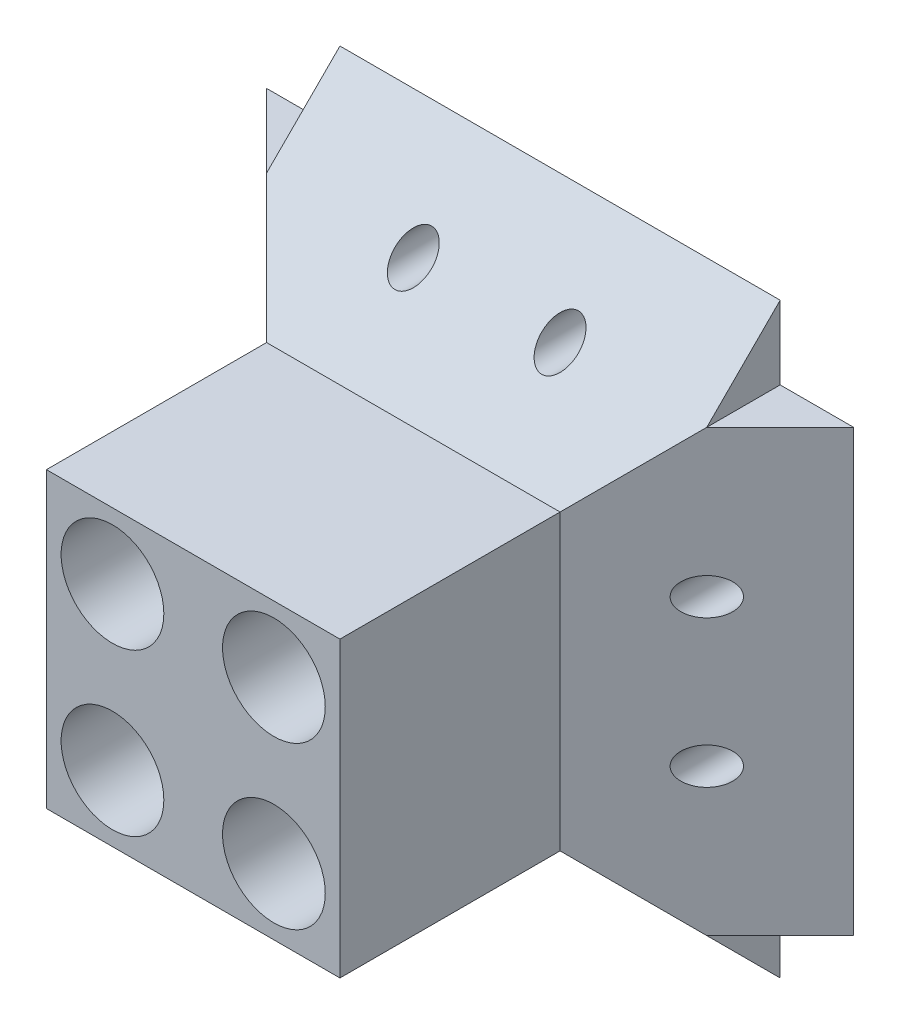
ISO-10303-21;
HEADER;
FILE_DESCRIPTION(('STEP AP214'),'2;1');
FILE_NAME('part.step','',(''),(''),'','','');
FILE_SCHEMA(('AUTOMOTIVE_DESIGN { 1 0 10303 214 1 1 1 1 }'));
ENDSEC;
DATA;
#1=APPLICATION_CONTEXT('core data for automotive mechanical design processes');
#2=APPLICATION_PROTOCOL_DEFINITION('international standard','automotive_design',2000,#1);
#3=PRODUCT_CONTEXT('',#1,'mechanical');
#4=PRODUCT('Part','Part','',(#3));
#5=PRODUCT_RELATED_PRODUCT_CATEGORY('part','',(#4));
#6=PRODUCT_DEFINITION_FORMATION('','',#4);
#7=PRODUCT_DEFINITION_CONTEXT('part definition',#1,'design');
#8=PRODUCT_DEFINITION('design','',#6,#7);
#9=PRODUCT_DEFINITION_SHAPE('','',#8);
#10=(LENGTH_UNIT() NAMED_UNIT(*) SI_UNIT(.MILLI.,.METRE.));
#11=(NAMED_UNIT(*) PLANE_ANGLE_UNIT() SI_UNIT($,.RADIAN.));
#12=(NAMED_UNIT(*) SI_UNIT($,.STERADIAN.) SOLID_ANGLE_UNIT());
#13=UNCERTAINTY_MEASURE_WITH_UNIT(LENGTH_MEASURE(1.E-05),#10,'distance_accuracy_value','');
#14=(GEOMETRIC_REPRESENTATION_CONTEXT(3) GLOBAL_UNCERTAINTY_ASSIGNED_CONTEXT((#13)) GLOBAL_UNIT_ASSIGNED_CONTEXT((#10,
#11,#12)) REPRESENTATION_CONTEXT('',''));
#15=CARTESIAN_POINT('',(0.,0.,0.));
#16=DIRECTION('',(0.,0.,1.));
#17=DIRECTION('',(1.,0.,0.));
#18=AXIS2_PLACEMENT_3D('',#15,#16,#17);
#19=CARTESIAN_POINT('',(14.9999999999999,20.0000000000001,15.));
#20=DIRECTION('',(0.,-0.707106781186547,-0.707106781186548));
#21=DIRECTION('',(0.,0.707106781186548,-0.707106781186547));
#22=AXIS2_PLACEMENT_3D('',#19,#20,#21);
#23=PLANE('',#22);
#24=CARTESIAN_POINT('',(4.99999999999995,15.,20.));
#25=DIRECTION('',(0.,-0.707106781186547,-0.707106781186548));
#26=DIRECTION('',(0.,0.707106781186548,-0.707106781186547));
#27=AXIS2_PLACEMENT_3D('',#24,#25,#26);
#28=ELLIPSE('',#27,1.76776695296637,1.25);
#29=CARTESIAN_POINT('',(4.99999999999994,16.25,18.75));
#30=VERTEX_POINT('',#29);
#31=EDGE_CURVE('E218',#30,#30,#28,.T.);
#32=ORIENTED_EDGE('',*,*,#31,.T.);
#33=EDGE_LOOP('',(#32));
#34=FACE_BOUND('',#33,.T.);
#35=CARTESIAN_POINT('',(-5.00000000000005,15.,20.));
#36=DIRECTION('',(0.,-0.707106781186547,-0.707106781186548));
#37=DIRECTION('',(0.,0.707106781186548,-0.707106781186547));
#38=AXIS2_PLACEMENT_3D('',#35,#36,#37);
#39=ELLIPSE('',#38,1.76776695296637,1.25);
#40=CARTESIAN_POINT('',(-5.00000000000005,16.25,18.75));
#41=VERTEX_POINT('',#40);
#42=EDGE_CURVE('E220',#41,#41,#39,.T.);
#43=ORIENTED_EDGE('',*,*,#42,.T.);
#44=EDGE_LOOP('',(#43));
#45=FACE_BOUND('',#44,.T.);
#46=DIRECTION('',(-0.577350269189624,-0.577350269189628,0.577350269189626));
#47=VECTOR('',#46,1.);
#48=CARTESIAN_POINT('',(18.3333333333332,18.3333333333334,16.6666666666667));
#49=LINE('',#48,#47);
#50=CARTESIAN_POINT('',(15.,15.,20.0000000000001));
#51=VERTEX_POINT('',#50);
#52=CARTESIAN_POINT('',(9.99999999999992,10.,25.));
#53=VERTEX_POINT('',#52);
#54=EDGE_CURVE('E154',#51,#53,#49,.T.);
#55=ORIENTED_EDGE('',*,*,#54,.F.);
#56=DIRECTION('',(0.,-0.707106781186548,0.707106781186547));
#57=VECTOR('',#56,1.);
#58=CARTESIAN_POINT('',(14.9999999999999,20.0000000000001,15.));
#59=LINE('',#58,#57);
#60=CARTESIAN_POINT('',(14.9999999999999,20.0000000000001,15.));
#61=VERTEX_POINT('',#60);
#62=EDGE_CURVE('E245',#61,#51,#59,.T.);
#63=ORIENTED_EDGE('',*,*,#62,.F.);
#64=DIRECTION('',(-1.,0.,0.));
#65=VECTOR('',#64,1.);
#66=CARTESIAN_POINT('',(-15.0000000000001,19.9999999999999,15.));
#67=LINE('',#66,#65);
#68=CARTESIAN_POINT('',(-15.0000000000001,20.,15.));
#69=VERTEX_POINT('',#68);
#70=EDGE_CURVE('E174',#61,#69,#67,.T.);
#71=ORIENTED_EDGE('',*,*,#70,.T.);
#72=DIRECTION('',(0.,-0.707106781186548,0.707106781186547));
#73=VECTOR('',#72,1.);
#74=CARTESIAN_POINT('',(-15.0000000000001,20.,15.));
#75=LINE('',#74,#73);
#76=CARTESIAN_POINT('',(-15.,15.,20.));
#77=VERTEX_POINT('',#76);
#78=EDGE_CURVE('E244',#69,#77,#75,.T.);
#79=ORIENTED_EDGE('',*,*,#78,.T.);
#80=DIRECTION('',(0.577350269189627,-0.577350269189625,0.577350269189626));
#81=VECTOR('',#80,1.);
#82=CARTESIAN_POINT('',(-8.33333333333337,8.33333333333334,26.6666666666666));
#83=LINE('',#82,#81);
#84=CARTESIAN_POINT('',(-10.,9.99999999999997,25.));
#85=VERTEX_POINT('',#84);
#86=EDGE_CURVE('E168',#77,#85,#83,.T.);
#87=ORIENTED_EDGE('',*,*,#86,.T.);
#88=DIRECTION('',(1.,0.,0.));
#89=VECTOR('',#88,1.);
#90=CARTESIAN_POINT('',(-15.,9.99999999999995,25.));
#91=LINE('',#90,#89);
#92=EDGE_CURVE('E166',#85,#53,#91,.T.);
#93=ORIENTED_EDGE('',*,*,#92,.T.);
#94=EDGE_LOOP('',(#55,#63,#71,#79,#87,#93));
#95=FACE_BOUND('',#94,.T.);
#96=ADVANCED_FACE('F41',(#34,#45,#95),#23,.F.);
#97=CARTESIAN_POINT('',(-14.9999999999998,-20.0000000000002,15.));
#98=DIRECTION('',(0.,0.707106781186547,-0.707106781186548));
#99=DIRECTION('',(0.,0.707106781186548,0.707106781186547));
#100=AXIS2_PLACEMENT_3D('',#97,#98,#99);
#101=PLANE('',#100);
#102=CARTESIAN_POINT('',(-4.99999999999984,-15.0000000000001,20.));
#103=DIRECTION('',(0.,0.707106781186547,-0.707106781186548));
#104=DIRECTION('',(0.,-0.707106781186548,-0.707106781186547));
#105=AXIS2_PLACEMENT_3D('',#102,#103,#104);
#106=ELLIPSE('',#105,1.76776695296637,1.25);
#107=CARTESIAN_POINT('',(-4.99999999999983,-16.2500000000001,18.75));
#108=VERTEX_POINT('',#107);
#109=EDGE_CURVE('E205',#108,#108,#106,.T.);
#110=ORIENTED_EDGE('',*,*,#109,.T.);
#111=EDGE_LOOP('',(#110));
#112=FACE_BOUND('',#111,.T.);
#113=CARTESIAN_POINT('',(5.00000000000015,-15.,20.));
#114=DIRECTION('',(0.,0.707106781186547,-0.707106781186548));
#115=DIRECTION('',(0.,-0.707106781186548,-0.707106781186547));
#116=AXIS2_PLACEMENT_3D('',#113,#114,#115);
#117=ELLIPSE('',#116,1.76776695296637,1.25);
#118=CARTESIAN_POINT('',(5.00000000000017,-16.25,18.75));
#119=VERTEX_POINT('',#118);
#120=EDGE_CURVE('E208',#119,#119,#117,.T.);
#121=ORIENTED_EDGE('',*,*,#120,.T.);
#122=EDGE_LOOP('',(#121));
#123=FACE_BOUND('',#122,.T.);
#124=DIRECTION('',(0.577350269189629,-0.577350269189621,-0.577350269189627));
#125=VECTOR('',#124,1.);
#126=CARTESIAN_POINT('',(8.33333333333341,-8.33333333333334,26.6666666666666));
#127=LINE('',#126,#125);
#128=CARTESIAN_POINT('',(9.99999999999999,-9.9999999999999,25.));
#129=VERTEX_POINT('',#128);
#130=CARTESIAN_POINT('',(15.0000000000002,-15.,19.9999999999999));
#131=VERTEX_POINT('',#130);
#132=EDGE_CURVE('E11',#129,#131,#127,.T.);
#133=ORIENTED_EDGE('',*,*,#132,.F.);
#134=DIRECTION('',(-1.,0.,0.));
#135=VECTOR('',#134,1.);
#136=CARTESIAN_POINT('',(15.0000000000001,-9.99999999999984,25.));
#137=LINE('',#136,#135);
#138=CARTESIAN_POINT('',(-10.,-10.0000000000001,25.));
#139=VERTEX_POINT('',#138);
#140=EDGE_CURVE('E247',#129,#139,#137,.T.);
#141=ORIENTED_EDGE('',*,*,#140,.T.);
#142=DIRECTION('',(0.577350269189624,0.57735026918963,0.577350269189624));
#143=VECTOR('',#142,1.);
#144=CARTESIAN_POINT('',(-8.33333333333322,-8.33333333333331,26.6666666666668));
#145=LINE('',#144,#143);
#146=CARTESIAN_POINT('',(-14.9999999999998,-15.,20.0000000000002));
#147=VERTEX_POINT('',#146);
#148=EDGE_CURVE('E232',#147,#139,#145,.T.);
#149=ORIENTED_EDGE('',*,*,#148,.F.);
#150=DIRECTION('',(0.,0.707106781186548,0.707106781186547));
#151=VECTOR('',#150,1.);
#152=CARTESIAN_POINT('',(-14.9999999999998,-20.0000000000002,15.));
#153=LINE('',#152,#151);
#154=CARTESIAN_POINT('',(-14.9999999999998,-20.0000000000002,15.));
#155=VERTEX_POINT('',#154);
#156=EDGE_CURVE('E226',#155,#147,#153,.T.);
#157=ORIENTED_EDGE('',*,*,#156,.F.);
#158=DIRECTION('',(1.,0.,0.));
#159=VECTOR('',#158,1.);
#160=CARTESIAN_POINT('',(15.0000000000002,-19.9999999999998,15.));
#161=LINE('',#160,#159);
#162=CARTESIAN_POINT('',(15.0000000000002,-19.9999999999998,15.));
#163=VERTEX_POINT('',#162);
#164=EDGE_CURVE('E249',#155,#163,#161,.T.);
#165=ORIENTED_EDGE('',*,*,#164,.T.);
#166=DIRECTION('',(0.,0.707106781186548,0.707106781186547));
#167=VECTOR('',#166,1.);
#168=CARTESIAN_POINT('',(15.0000000000002,-19.9999999999998,15.));
#169=LINE('',#168,#167);
#170=EDGE_CURVE('E222',#163,#131,#169,.T.);
#171=ORIENTED_EDGE('',*,*,#170,.T.);
#172=EDGE_LOOP('',(#133,#141,#149,#157,#165,#171));
#173=FACE_BOUND('',#172,.T.);
#174=ADVANCED_FACE('F363',(#112,#123,#173),#101,.F.);
#175=CARTESIAN_POINT('',(14.9999999999999,20.0000000000001,15.));
#176=DIRECTION('',(-1.,0.,0.));
#177=DIRECTION('',(0.,-1.,0.));
#178=AXIS2_PLACEMENT_3D('',#175,#176,#177);
#179=PLANE('',#178);
#180=DIRECTION('',(0.,-1.,0.));
#181=VECTOR('',#180,1.);
#182=CARTESIAN_POINT('',(14.9999999999999,20.0000000000001,15.));
#183=LINE('',#182,#181);
#184=CARTESIAN_POINT('',(14.9999999999999,15.,15.));
#185=VERTEX_POINT('',#184);
#186=EDGE_CURVE('E271',#61,#185,#183,.T.);
#187=ORIENTED_EDGE('',*,*,#186,.F.);
#188=ORIENTED_EDGE('',*,*,#62,.T.);
#189=DIRECTION('',(0.,0.,-1.));
#190=VECTOR('',#189,1.);
#191=CARTESIAN_POINT('',(14.9999999999999,15.,15.));
#192=LINE('',#191,#190);
#193=EDGE_CURVE('E280',#51,#185,#192,.T.);
#194=ORIENTED_EDGE('',*,*,#193,.T.);
#195=EDGE_LOOP('',(#187,#188,#194));
#196=FACE_BOUND('',#195,.T.);
#197=ADVANCED_FACE('F380',(#196),#179,.F.);
#198=CARTESIAN_POINT('',(-10.,10.,40.));
#199=DIRECTION('',(0.,-1.,0.));
#200=DIRECTION('',(0.,0.,-1.));
#201=AXIS2_PLACEMENT_3D('',#198,#199,#200);
#202=PLANE('',#201);
#203=ORIENTED_EDGE('',*,*,#92,.F.);
#204=DIRECTION('',(0.,0.,-1.));
#205=VECTOR('',#204,1.);
#206=CARTESIAN_POINT('',(-10.,10.,40.));
#207=LINE('',#206,#205);
#208=CARTESIAN_POINT('',(-10.,10.,40.));
#209=VERTEX_POINT('',#208);
#210=EDGE_CURVE('E187',#209,#85,#207,.T.);
#211=ORIENTED_EDGE('',*,*,#210,.F.);
#212=DIRECTION('',(-1.,0.,0.));
#213=VECTOR('',#212,1.);
#214=CARTESIAN_POINT('',(-10.,10.,40.));
#215=LINE('',#214,#213);
#216=CARTESIAN_POINT('',(10.,10.,40.));
#217=VERTEX_POINT('',#216);
#218=EDGE_CURVE('E185',#217,#209,#215,.T.);
#219=ORIENTED_EDGE('',*,*,#218,.F.);
#220=DIRECTION('',(0.,0.,-1.));
#221=VECTOR('',#220,1.);
#222=CARTESIAN_POINT('',(10.,10.,40.));
#223=LINE('',#222,#221);
#224=EDGE_CURVE('E180',#217,#53,#223,.T.);
#225=ORIENTED_EDGE('',*,*,#224,.T.);
#226=EDGE_LOOP('',(#203,#211,#219,#225));
#227=FACE_BOUND('',#226,.T.);
#228=ADVANCED_FACE('F184',(#227),#202,.F.);
#229=CARTESIAN_POINT('',(-10.,10.,40.));
#230=DIRECTION('',(1.,0.,0.));
#231=DIRECTION('',(0.,0.,-1.));
#232=AXIS2_PLACEMENT_3D('',#229,#230,#231);
#233=PLANE('',#232);
#234=DIRECTION('',(0.,1.,0.));
#235=VECTOR('',#234,1.);
#236=CARTESIAN_POINT('',(-10.,-15.,25.));
#237=LINE('',#236,#235);
#238=EDGE_CURVE('E260',#139,#85,#237,.T.);
#239=ORIENTED_EDGE('',*,*,#238,.F.);
#240=DIRECTION('',(0.,0.,-1.));
#241=VECTOR('',#240,1.);
#242=CARTESIAN_POINT('',(-10.,-10.,40.));
#243=LINE('',#242,#241);
#244=CARTESIAN_POINT('',(-10.,-10.,40.));
#245=VERTEX_POINT('',#244);
#246=EDGE_CURVE('E192',#245,#139,#243,.T.);
#247=ORIENTED_EDGE('',*,*,#246,.F.);
#248=DIRECTION('',(0.,-1.,0.));
#249=VECTOR('',#248,1.);
#250=CARTESIAN_POINT('',(-10.,10.,40.));
#251=LINE('',#250,#249);
#252=EDGE_CURVE('E348',#209,#245,#251,.T.);
#253=ORIENTED_EDGE('',*,*,#252,.F.);
#254=ORIENTED_EDGE('',*,*,#210,.T.);
#255=EDGE_LOOP('',(#239,#247,#253,#254));
#256=FACE_BOUND('',#255,.T.);
#257=ADVANCED_FACE('F359',(#256),#233,.F.);
#258=CARTESIAN_POINT('',(-10.,-10.,40.));
#259=DIRECTION('',(0.,1.,0.));
#260=DIRECTION('',(0.,0.,1.));
#261=AXIS2_PLACEMENT_3D('',#258,#259,#260);
#262=PLANE('',#261);
#263=ORIENTED_EDGE('',*,*,#140,.F.);
#264=DIRECTION('',(0.,0.,-1.));
#265=VECTOR('',#264,1.);
#266=CARTESIAN_POINT('',(10.,-10.,40.));
#267=LINE('',#266,#265);
#268=CARTESIAN_POINT('',(10.,-10.,40.));
#269=VERTEX_POINT('',#268);
#270=EDGE_CURVE('E181',#269,#129,#267,.T.);
#271=ORIENTED_EDGE('',*,*,#270,.F.);
#272=DIRECTION('',(1.,0.,0.));
#273=VECTOR('',#272,1.);
#274=CARTESIAN_POINT('',(-10.,-10.,40.));
#275=LINE('',#274,#273);
#276=EDGE_CURVE('E64',#245,#269,#275,.T.);
#277=ORIENTED_EDGE('',*,*,#276,.F.);
#278=ORIENTED_EDGE('',*,*,#246,.T.);
#279=EDGE_LOOP('',(#263,#271,#277,#278));
#280=FACE_BOUND('',#279,.T.);
#281=ADVANCED_FACE('F355',(#280),#262,.F.);
#282=CARTESIAN_POINT('',(20.,15.,15.));
#283=DIRECTION('',(0.,-1.,0.));
#284=DIRECTION('',(1.,0.,0.));
#285=AXIS2_PLACEMENT_3D('',#282,#283,#284);
#286=PLANE('',#285);
#287=ORIENTED_EDGE('',*,*,#193,.F.);
#288=DIRECTION('',(-0.707106781186548,0.,0.707106781186547));
#289=VECTOR('',#288,1.);
#290=CARTESIAN_POINT('',(20.,15.,15.));
#291=LINE('',#290,#289);
#292=CARTESIAN_POINT('',(20.,15.,15.));
#293=VERTEX_POINT('',#292);
#294=EDGE_CURVE('E160',#293,#51,#291,.T.);
#295=ORIENTED_EDGE('',*,*,#294,.F.);
#296=DIRECTION('',(-1.,0.,0.));
#297=VECTOR('',#296,1.);
#298=CARTESIAN_POINT('',(20.,15.,15.));
#299=LINE('',#298,#297);
#300=EDGE_CURVE('E296',#293,#185,#299,.T.);
#301=ORIENTED_EDGE('',*,*,#300,.T.);
#302=EDGE_LOOP('',(#287,#295,#301));
#303=FACE_BOUND('',#302,.T.);
#304=ADVANCED_FACE('F378',(#303),#286,.F.);
#305=CARTESIAN_POINT('',(20.,-15.,15.));
#306=DIRECTION('',(0.,1.,0.));
#307=DIRECTION('',(0.,0.,1.));
#308=AXIS2_PLACEMENT_3D('',#305,#306,#307);
#309=PLANE('',#308);
#310=DIRECTION('',(0.,0.,1.));
#311=VECTOR('',#310,1.);
#312=CARTESIAN_POINT('',(15.0000000000002,-15.,15.));
#313=LINE('',#312,#311);
#314=CARTESIAN_POINT('',(15.0000000000002,-15.,15.));
#315=VERTEX_POINT('',#314);
#316=EDGE_CURVE('E278',#315,#131,#313,.T.);
#317=ORIENTED_EDGE('',*,*,#316,.F.);
#318=DIRECTION('',(-1.,0.,0.));
#319=VECTOR('',#318,1.);
#320=CARTESIAN_POINT('',(20.,-15.,15.));
#321=LINE('',#320,#319);
#322=CARTESIAN_POINT('',(20.,-15.,15.));
#323=VERTEX_POINT('',#322);
#324=EDGE_CURVE('E292',#323,#315,#321,.T.);
#325=ORIENTED_EDGE('',*,*,#324,.F.);
#326=DIRECTION('',(-0.707106781186548,0.,0.707106781186547));
#327=VECTOR('',#326,1.);
#328=CARTESIAN_POINT('',(20.,-15.,15.));
#329=LINE('',#328,#327);
#330=EDGE_CURVE('E287',#323,#131,#329,.T.);
#331=ORIENTED_EDGE('',*,*,#330,.T.);
#332=EDGE_LOOP('',(#317,#325,#331));
#333=FACE_BOUND('',#332,.T.);
#334=ADVANCED_FACE('F368',(#333),#309,.F.);
#335=CARTESIAN_POINT('',(20.,-15.,15.));
#336=DIRECTION('',(-0.707106781186547,0.,-0.707106781186548));
#337=DIRECTION('',(-0.707106781186548,0.,0.707106781186547));
#338=AXIS2_PLACEMENT_3D('',#335,#336,#337);
#339=PLANE('',#338);
#340=CARTESIAN_POINT('',(15.,-5.,20.));
#341=DIRECTION('',(-0.707106781186547,0.,-0.707106781186548));
#342=DIRECTION('',(0.707106781186548,0.,-0.707106781186547));
#343=AXIS2_PLACEMENT_3D('',#340,#341,#342);
#344=ELLIPSE('',#343,1.76776695296637,1.25);
#345=CARTESIAN_POINT('',(16.25,-5.,18.75));
#346=VERTEX_POINT('',#345);
#347=EDGE_CURVE('E201',#346,#346,#344,.T.);
#348=ORIENTED_EDGE('',*,*,#347,.T.);
#349=EDGE_LOOP('',(#348));
#350=FACE_BOUND('',#349,.T.);
#351=CARTESIAN_POINT('',(15.,5.,20.));
#352=DIRECTION('',(-0.707106781186547,0.,-0.707106781186548));
#353=DIRECTION('',(0.707106781186548,0.,-0.707106781186547));
#354=AXIS2_PLACEMENT_3D('',#351,#352,#353);
#355=ELLIPSE('',#354,1.76776695296637,1.25);
#356=CARTESIAN_POINT('',(16.25,5.,18.75));
#357=VERTEX_POINT('',#356);
#358=EDGE_CURVE('E198',#357,#357,#355,.T.);
#359=ORIENTED_EDGE('',*,*,#358,.T.);
#360=EDGE_LOOP('',(#359));
#361=FACE_BOUND('',#360,.T.);
#362=DIRECTION('',(0.,-1.,0.));
#363=VECTOR('',#362,1.);
#364=CARTESIAN_POINT('',(10.,15.,25.));
#365=LINE('',#364,#363);
#366=EDGE_CURVE('E49',#53,#129,#365,.T.);
#367=ORIENTED_EDGE('',*,*,#366,.T.);
#368=ORIENTED_EDGE('',*,*,#132,.T.);
#369=ORIENTED_EDGE('',*,*,#330,.F.);
#370=DIRECTION('',(0.,1.,0.));
#371=VECTOR('',#370,1.);
#372=CARTESIAN_POINT('',(20.,15.,15.));
#373=LINE('',#372,#371);
#374=EDGE_CURVE('E290',#323,#293,#373,.T.);
#375=ORIENTED_EDGE('',*,*,#374,.T.);
#376=ORIENTED_EDGE('',*,*,#294,.T.);
#377=ORIENTED_EDGE('',*,*,#54,.T.);
#378=EDGE_LOOP('',(#367,#368,#369,#375,#376,#377));
#379=FACE_BOUND('',#378,.T.);
#380=ADVANCED_FACE('F156',(#350,#361,#379),#339,.F.);
#381=CARTESIAN_POINT('',(10.,10.,40.));
#382=DIRECTION('',(-1.,0.,0.));
#383=DIRECTION('',(0.,-1.,0.));
#384=AXIS2_PLACEMENT_3D('',#381,#382,#383);
#385=PLANE('',#384);
#386=ORIENTED_EDGE('',*,*,#366,.F.);
#387=ORIENTED_EDGE('',*,*,#224,.F.);
#388=DIRECTION('',(0.,1.,0.));
#389=VECTOR('',#388,1.);
#390=CARTESIAN_POINT('',(10.,10.,40.));
#391=LINE('',#390,#389);
#392=EDGE_CURVE('E345',#269,#217,#391,.T.);
#393=ORIENTED_EDGE('',*,*,#392,.F.);
#394=ORIENTED_EDGE('',*,*,#270,.T.);
#395=EDGE_LOOP('',(#386,#387,#393,#394));
#396=FACE_BOUND('',#395,.T.);
#397=ADVANCED_FACE('F43',(#396),#385,.F.);
#398=CARTESIAN_POINT('',(2.92893218813453,0.,0.));
#399=DIRECTION('',(1.,0.,0.));
#400=DIRECTION('',(0.,0.,-1.));
#401=AXIS2_PLACEMENT_3D('',#398,#399,#400);
#402=PLANE('',#401);
#403=DIRECTION('',(0.,0.,-1.));
#404=VECTOR('',#403,1.);
#405=CARTESIAN_POINT('',(2.92893218813453,-2.92893218813449,0.));
#406=LINE('',#405,#404);
#407=CARTESIAN_POINT('',(2.92893218813453,-2.9289321881345,15.));
#408=VERTEX_POINT('',#407);
#409=CARTESIAN_POINT('',(2.92893218813453,-2.92893218813449,10.));
#410=VERTEX_POINT('',#409);
#411=EDGE_CURVE('E186',#408,#410,#406,.T.);
#412=ORIENTED_EDGE('',*,*,#411,.T.);
#413=DIRECTION('',(0.,-1.,0.));
#414=VECTOR('',#413,1.);
#415=CARTESIAN_POINT('',(2.92893218813453,2.92893218813454,10.));
#416=LINE('',#415,#414);
#417=CARTESIAN_POINT('',(2.92893218813453,2.92893218813454,10.));
#418=VERTEX_POINT('',#417);
#419=EDGE_CURVE('E56',#418,#410,#416,.T.);
#420=ORIENTED_EDGE('',*,*,#419,.F.);
#421=DIRECTION('',(0.,0.,1.));
#422=VECTOR('',#421,1.);
#423=CARTESIAN_POINT('',(2.92893218813453,2.92893218813454,0.));
#424=LINE('',#423,#422);
#425=CARTESIAN_POINT('',(2.92893218813453,2.92893218813454,15.));
#426=VERTEX_POINT('',#425);
#427=EDGE_CURVE('E190',#418,#426,#424,.T.);
#428=ORIENTED_EDGE('',*,*,#427,.T.);
#429=DIRECTION('',(0.,-1.,0.));
#430=VECTOR('',#429,1.);
#431=CARTESIAN_POINT('',(2.92893218813453,7.5,15.));
#432=LINE('',#431,#430);
#433=EDGE_CURVE('E342',#426,#408,#432,.T.);
#434=ORIENTED_EDGE('',*,*,#433,.T.);
#435=EDGE_LOOP('',(#412,#420,#428,#434));
#436=FACE_BOUND('',#435,.T.);
#437=ADVANCED_FACE('F477',(#436),#402,.T.);
#438=CARTESIAN_POINT('',(0.,2.92893218813453,0.));
#439=DIRECTION('',(0.,1.,0.));
#440=DIRECTION('',(0.,0.,-1.));
#441=AXIS2_PLACEMENT_3D('',#438,#439,#440);
#442=PLANE('',#441);
#443=ORIENTED_EDGE('',*,*,#427,.F.);
#444=DIRECTION('',(1.,0.,0.));
#445=VECTOR('',#444,1.);
#446=CARTESIAN_POINT('',(2.92893218813453,2.92893218813454,10.));
#447=LINE('',#446,#445);
#448=CARTESIAN_POINT('',(-2.92893218813453,2.92893218813454,10.));
#449=VERTEX_POINT('',#448);
#450=EDGE_CURVE('E300',#449,#418,#447,.T.);
#451=ORIENTED_EDGE('',*,*,#450,.F.);
#452=DIRECTION('',(0.,0.,1.));
#453=VECTOR('',#452,1.);
#454=CARTESIAN_POINT('',(-2.92893218813453,2.92893218813452,0.));
#455=LINE('',#454,#453);
#456=CARTESIAN_POINT('',(-2.92893218813453,2.92893218813452,15.));
#457=VERTEX_POINT('',#456);
#458=EDGE_CURVE('E340',#449,#457,#455,.T.);
#459=ORIENTED_EDGE('',*,*,#458,.T.);
#460=DIRECTION('',(1.,0.,0.));
#461=VECTOR('',#460,1.);
#462=CARTESIAN_POINT('',(-7.50000000000001,2.9289321881345,15.));
#463=LINE('',#462,#461);
#464=EDGE_CURVE('E337',#457,#426,#463,.T.);
#465=ORIENTED_EDGE('',*,*,#464,.T.);
#466=EDGE_LOOP('',(#443,#451,#459,#465));
#467=FACE_BOUND('',#466,.T.);
#468=ADVANCED_FACE('F473',(#467),#442,.T.);
#469=CARTESIAN_POINT('',(-2.92893218813453,0.,0.));
#470=DIRECTION('',(-1.,0.,0.));
#471=DIRECTION('',(0.,0.,-1.));
#472=AXIS2_PLACEMENT_3D('',#469,#470,#471);
#473=PLANE('',#472);
#474=ORIENTED_EDGE('',*,*,#458,.F.);
#475=DIRECTION('',(0.,-1.,0.));
#476=VECTOR('',#475,1.);
#477=CARTESIAN_POINT('',(-2.92893218813453,0.,10.));
#478=LINE('',#477,#476);
#479=CARTESIAN_POINT('',(-2.92893218813453,-2.92893218813456,10.));
#480=VERTEX_POINT('',#479);
#481=EDGE_CURVE('E302',#449,#480,#478,.T.);
#482=ORIENTED_EDGE('',*,*,#481,.T.);
#483=DIRECTION('',(0.,0.,1.));
#484=VECTOR('',#483,1.);
#485=CARTESIAN_POINT('',(-2.92893218813453,-2.92893218813456,0.));
#486=LINE('',#485,#484);
#487=CARTESIAN_POINT('',(-2.92893218813453,-2.92893218813456,15.));
#488=VERTEX_POINT('',#487);
#489=EDGE_CURVE('E335',#480,#488,#486,.T.);
#490=ORIENTED_EDGE('',*,*,#489,.T.);
#491=DIRECTION('',(0.,1.,0.));
#492=VECTOR('',#491,1.);
#493=CARTESIAN_POINT('',(-2.92893218813453,-7.5,15.));
#494=LINE('',#493,#492);
#495=EDGE_CURVE('E332',#488,#457,#494,.T.);
#496=ORIENTED_EDGE('',*,*,#495,.T.);
#497=EDGE_LOOP('',(#474,#482,#490,#496));
#498=FACE_BOUND('',#497,.T.);
#499=ADVANCED_FACE('F469',(#498),#473,.T.);
#500=CARTESIAN_POINT('',(0.,-2.92893218813453,0.));
#501=DIRECTION('',(0.,-1.,0.));
#502=DIRECTION('',(0.,0.,-1.));
#503=AXIS2_PLACEMENT_3D('',#500,#501,#502);
#504=PLANE('',#503);
#505=ORIENTED_EDGE('',*,*,#489,.F.);
#506=DIRECTION('',(1.,0.,0.));
#507=VECTOR('',#506,1.);
#508=CARTESIAN_POINT('',(0.,-2.92893218813453,10.));
#509=LINE('',#508,#507);
#510=EDGE_CURVE('E182',#480,#410,#509,.T.);
#511=ORIENTED_EDGE('',*,*,#510,.T.);
#512=ORIENTED_EDGE('',*,*,#411,.F.);
#513=DIRECTION('',(-1.,0.,0.));
#514=VECTOR('',#513,1.);
#515=CARTESIAN_POINT('',(7.50000000000003,-2.92893218813445,15.));
#516=LINE('',#515,#514);
#517=EDGE_CURVE('E327',#408,#488,#516,.T.);
#518=ORIENTED_EDGE('',*,*,#517,.T.);
#519=EDGE_LOOP('',(#505,#511,#512,#518));
#520=FACE_BOUND('',#519,.T.);
#521=ADVANCED_FACE('F465',(#520),#504,.T.);
#522=CARTESIAN_POINT('',(0.,0.,40.));
#523=DIRECTION('',(0.,0.,1.));
#524=DIRECTION('',(1.,0.,0.));
#525=AXIS2_PLACEMENT_3D('',#522,#523,#524);
#526=PLANE('',#525);
#527=CARTESIAN_POINT('',(5.5,5.5,40.));
#528=DIRECTION('',(0.,0.,1.));
#529=DIRECTION('',(1.,0.,0.));
#530=AXIS2_PLACEMENT_3D('',#527,#528,#529);
#531=CIRCLE('',#530,3.5);
#532=CARTESIAN_POINT('',(9.,5.5,40.));
#533=VERTEX_POINT('',#532);
#534=EDGE_CURVE('E312',#533,#533,#531,.T.);
#535=ORIENTED_EDGE('',*,*,#534,.F.);
#536=EDGE_LOOP('',(#535));
#537=FACE_BOUND('',#536,.T.);
#538=CARTESIAN_POINT('',(-5.5,-5.5,40.));
#539=DIRECTION('',(0.,0.,1.));
#540=DIRECTION('',(1.,0.,0.));
#541=AXIS2_PLACEMENT_3D('',#538,#539,#540);
#542=CIRCLE('',#541,3.5);
#543=CARTESIAN_POINT('',(-2.,-5.5,40.));
#544=VERTEX_POINT('',#543);
#545=EDGE_CURVE('E319',#544,#544,#542,.T.);
#546=ORIENTED_EDGE('',*,*,#545,.F.);
#547=EDGE_LOOP('',(#546));
#548=FACE_BOUND('',#547,.T.);
#549=CARTESIAN_POINT('',(5.5,-5.5,40.));
#550=DIRECTION('',(0.,0.,1.));
#551=DIRECTION('',(1.,0.,0.));
#552=AXIS2_PLACEMENT_3D('',#549,#550,#551);
#553=CIRCLE('',#552,3.5);
#554=CARTESIAN_POINT('',(9.,-5.5,40.));
#555=VERTEX_POINT('',#554);
#556=EDGE_CURVE('E306',#555,#555,#553,.T.);
#557=ORIENTED_EDGE('',*,*,#556,.F.);
#558=EDGE_LOOP('',(#557));
#559=FACE_BOUND('',#558,.T.);
#560=CARTESIAN_POINT('',(-5.5,5.5,40.));
#561=DIRECTION('',(0.,0.,1.));
#562=DIRECTION('',(1.,0.,0.));
#563=AXIS2_PLACEMENT_3D('',#560,#561,#562);
#564=CIRCLE('',#563,3.5);
#565=CARTESIAN_POINT('',(-2.,5.5,40.));
#566=VERTEX_POINT('',#565);
#567=EDGE_CURVE('E315',#566,#566,#564,.T.);
#568=ORIENTED_EDGE('',*,*,#567,.F.);
#569=EDGE_LOOP('',(#568));
#570=FACE_BOUND('',#569,.T.);
#571=ORIENTED_EDGE('',*,*,#392,.T.);
#572=ORIENTED_EDGE('',*,*,#218,.T.);
#573=ORIENTED_EDGE('',*,*,#252,.T.);
#574=ORIENTED_EDGE('',*,*,#276,.T.);
#575=EDGE_LOOP('',(#571,#572,#573,#574));
#576=FACE_BOUND('',#575,.T.);
#577=ADVANCED_FACE('F468',(#537,#548,#559,#570,#576),#526,.T.);
#578=CARTESIAN_POINT('',(2.92893218813453,7.5,15.));
#579=DIRECTION('',(0.,0.,1.));
#580=DIRECTION('',(0.,-1.,0.));
#581=AXIS2_PLACEMENT_3D('',#578,#579,#580);
#582=PLANE('',#581);
#583=CARTESIAN_POINT('',(5.5,-5.5,15.));
#584=DIRECTION('',(0.,0.,1.));
#585=DIRECTION('',(1.,0.,0.));
#586=AXIS2_PLACEMENT_3D('',#583,#584,#585);
#587=CIRCLE('',#586,3.5);
#588=CARTESIAN_POINT('',(9.,-5.5,15.));
#589=VERTEX_POINT('',#588);
#590=EDGE_CURVE('E305',#589,#589,#587,.T.);
#591=ORIENTED_EDGE('',*,*,#590,.T.);
#592=EDGE_LOOP('',(#591));
#593=FACE_BOUND('',#592,.T.);
#594=CARTESIAN_POINT('',(5.00000000000015,-15.,15.));
#595=DIRECTION('',(0.,0.,-1.));
#596=DIRECTION('',(1.,0.,0.));
#597=AXIS2_PLACEMENT_3D('',#594,#595,#596);
#598=CIRCLE('',#597,1.25);
#599=CARTESIAN_POINT('',(6.25000000000015,-14.9999999999999,15.));
#600=VERTEX_POINT('',#599);
#601=EDGE_CURVE('E163',#600,#600,#598,.T.);
#602=ORIENTED_EDGE('',*,*,#601,.F.);
#603=EDGE_LOOP('',(#602));
#604=FACE_BOUND('',#603,.T.);
#605=CARTESIAN_POINT('',(-4.99999999999984,-15.0000000000001,15.));
#606=DIRECTION('',(0.,0.,-1.));
#607=DIRECTION('',(1.,0.,0.));
#608=AXIS2_PLACEMENT_3D('',#605,#606,#607);
#609=CIRCLE('',#608,1.25);
#610=CARTESIAN_POINT('',(-3.74999999999984,-15.,15.));
#611=VERTEX_POINT('',#610);
#612=EDGE_CURVE('E827',#611,#611,#609,.T.);
#613=ORIENTED_EDGE('',*,*,#612,.F.);
#614=EDGE_LOOP('',(#613));
#615=FACE_BOUND('',#614,.T.);
#616=CARTESIAN_POINT('',(-15.,-5.,15.));
#617=DIRECTION('',(0.,0.,-1.));
#618=DIRECTION('',(0.,-1.,0.));
#619=AXIS2_PLACEMENT_3D('',#616,#617,#618);
#620=CIRCLE('',#619,1.25);
#621=CARTESIAN_POINT('',(-15.,-6.25,15.));
#622=VERTEX_POINT('',#621);
#623=EDGE_CURVE('E822',#622,#622,#620,.T.);
#624=ORIENTED_EDGE('',*,*,#623,.F.);
#625=EDGE_LOOP('',(#624));
#626=FACE_BOUND('',#625,.T.);
#627=CARTESIAN_POINT('',(-15.,5.,15.));
#628=DIRECTION('',(0.,0.,-1.));
#629=DIRECTION('',(0.,-1.,0.));
#630=AXIS2_PLACEMENT_3D('',#627,#628,#629);
#631=CIRCLE('',#630,1.25);
#632=CARTESIAN_POINT('',(-15.,3.75,15.));
#633=VERTEX_POINT('',#632);
#634=EDGE_CURVE('E818',#633,#633,#631,.T.);
#635=ORIENTED_EDGE('',*,*,#634,.F.);
#636=EDGE_LOOP('',(#635));
#637=FACE_BOUND('',#636,.T.);
#638=CARTESIAN_POINT('',(-5.00000000000005,15.,15.));
#639=DIRECTION('',(0.,0.,-1.));
#640=DIRECTION('',(-1.,0.,0.));
#641=AXIS2_PLACEMENT_3D('',#638,#639,#640);
#642=CIRCLE('',#641,1.25);
#643=CARTESIAN_POINT('',(-6.25000000000005,15.,15.));
#644=VERTEX_POINT('',#643);
#645=EDGE_CURVE('E816',#644,#644,#642,.T.);
#646=ORIENTED_EDGE('',*,*,#645,.F.);
#647=EDGE_LOOP('',(#646));
#648=FACE_BOUND('',#647,.T.);
#649=CARTESIAN_POINT('',(4.99999999999995,15.,15.));
#650=DIRECTION('',(0.,0.,-1.));
#651=DIRECTION('',(-1.,0.,0.));
#652=AXIS2_PLACEMENT_3D('',#649,#650,#651);
#653=CIRCLE('',#652,1.25);
#654=CARTESIAN_POINT('',(3.74999999999995,15.,15.));
#655=VERTEX_POINT('',#654);
#656=EDGE_CURVE('E209',#655,#655,#653,.T.);
#657=ORIENTED_EDGE('',*,*,#656,.F.);
#658=EDGE_LOOP('',(#657));
#659=FACE_BOUND('',#658,.T.);
#660=ORIENTED_EDGE('',*,*,#186,.T.);
#661=ORIENTED_EDGE('',*,*,#300,.F.);
#662=ORIENTED_EDGE('',*,*,#374,.F.);
#663=ORIENTED_EDGE('',*,*,#324,.T.);
#664=DIRECTION('',(0.,1.,0.));
#665=VECTOR('',#664,1.);
#666=CARTESIAN_POINT('',(15.0000000000002,-19.9999999999998,15.));
#667=LINE('',#666,#665);
#668=EDGE_CURVE('E256',#163,#315,#667,.T.);
#669=ORIENTED_EDGE('',*,*,#668,.F.);
#670=ORIENTED_EDGE('',*,*,#164,.F.);
#671=DIRECTION('',(0.,1.,0.));
#672=VECTOR('',#671,1.);
#673=CARTESIAN_POINT('',(-14.9999999999998,-20.0000000000002,15.));
#674=LINE('',#673,#672);
#675=CARTESIAN_POINT('',(-14.9999999999998,-15.,15.));
#676=VERTEX_POINT('',#675);
#677=EDGE_CURVE('E251',#155,#676,#674,.T.);
#678=ORIENTED_EDGE('',*,*,#677,.T.);
#679=DIRECTION('',(1.,0.,0.));
#680=VECTOR('',#679,1.);
#681=CARTESIAN_POINT('',(-20.,-15.,15.));
#682=LINE('',#681,#680);
#683=CARTESIAN_POINT('',(-20.,-15.,15.));
#684=VERTEX_POINT('',#683);
#685=EDGE_CURVE('E267',#684,#676,#682,.T.);
#686=ORIENTED_EDGE('',*,*,#685,.F.);
#687=DIRECTION('',(0.,-1.,0.));
#688=VECTOR('',#687,1.);
#689=CARTESIAN_POINT('',(-20.,-15.,15.));
#690=LINE('',#689,#688);
#691=CARTESIAN_POINT('',(-20.,15.,15.));
#692=VERTEX_POINT('',#691);
#693=EDGE_CURVE('E261',#692,#684,#690,.T.);
#694=ORIENTED_EDGE('',*,*,#693,.F.);
#695=DIRECTION('',(1.,0.,0.));
#696=VECTOR('',#695,1.);
#697=CARTESIAN_POINT('',(-20.,15.,15.));
#698=LINE('',#697,#696);
#699=CARTESIAN_POINT('',(-15.0000000000001,15.,15.));
#700=VERTEX_POINT('',#699);
#701=EDGE_CURVE('E263',#692,#700,#698,.T.);
#702=ORIENTED_EDGE('',*,*,#701,.T.);
#703=DIRECTION('',(0.,-1.,0.));
#704=VECTOR('',#703,1.);
#705=CARTESIAN_POINT('',(-15.0000000000001,19.9999999999999,15.));
#706=LINE('',#705,#704);
#707=EDGE_CURVE('E275',#69,#700,#706,.T.);
#708=ORIENTED_EDGE('',*,*,#707,.F.);
#709=ORIENTED_EDGE('',*,*,#70,.F.);
#710=EDGE_LOOP('',(#660,#661,#662,#663,#669,#670,#678,#686,#694,#702,#708,#709));
#711=FACE_BOUND('',#710,.T.);
#712=CARTESIAN_POINT('',(15.,-5.,15.));
#713=DIRECTION('',(0.,0.,-1.));
#714=DIRECTION('',(0.,1.,0.));
#715=AXIS2_PLACEMENT_3D('',#712,#713,#714);
#716=CIRCLE('',#715,1.25);
#717=CARTESIAN_POINT('',(15.,-3.75,15.));
#718=VERTEX_POINT('',#717);
#719=EDGE_CURVE('E202',#718,#718,#716,.T.);
#720=ORIENTED_EDGE('',*,*,#719,.F.);
#721=EDGE_LOOP('',(#720));
#722=FACE_BOUND('',#721,.T.);
#723=CARTESIAN_POINT('',(15.,5.,15.));
#724=DIRECTION('',(0.,0.,-1.));
#725=DIRECTION('',(0.,1.,0.));
#726=AXIS2_PLACEMENT_3D('',#723,#724,#725);
#727=CIRCLE('',#726,1.25);
#728=CARTESIAN_POINT('',(15.,6.25,15.));
#729=VERTEX_POINT('',#728);
#730=EDGE_CURVE('E282',#729,#729,#727,.T.);
#731=ORIENTED_EDGE('',*,*,#730,.F.);
#732=EDGE_LOOP('',(#731));
#733=FACE_BOUND('',#732,.T.);
#734=CARTESIAN_POINT('',(5.5,5.5,15.));
#735=DIRECTION('',(0.,0.,1.));
#736=DIRECTION('',(1.,0.,0.));
#737=AXIS2_PLACEMENT_3D('',#734,#735,#736);
#738=CIRCLE('',#737,3.5);
#739=CARTESIAN_POINT('',(9.,5.5,15.));
#740=VERTEX_POINT('',#739);
#741=EDGE_CURVE('E316',#740,#740,#738,.T.);
#742=ORIENTED_EDGE('',*,*,#741,.T.);
#743=EDGE_LOOP('',(#742));
#744=FACE_BOUND('',#743,.T.);
#745=CARTESIAN_POINT('',(-5.5,5.5,15.));
#746=DIRECTION('',(0.,0.,1.));
#747=DIRECTION('',(1.,0.,0.));
#748=AXIS2_PLACEMENT_3D('',#745,#746,#747);
#749=CIRCLE('',#748,3.5);
#750=CARTESIAN_POINT('',(-2.,5.5,15.));
#751=VERTEX_POINT('',#750);
#752=EDGE_CURVE('E324',#751,#751,#749,.T.);
#753=ORIENTED_EDGE('',*,*,#752,.T.);
#754=EDGE_LOOP('',(#753));
#755=FACE_BOUND('',#754,.T.);
#756=ORIENTED_EDGE('',*,*,#433,.F.);
#757=ORIENTED_EDGE('',*,*,#464,.F.);
#758=ORIENTED_EDGE('',*,*,#495,.F.);
#759=ORIENTED_EDGE('',*,*,#517,.F.);
#760=EDGE_LOOP('',(#756,#757,#758,#759));
#761=FACE_BOUND('',#760,.T.);
#762=CARTESIAN_POINT('',(-5.5,-5.5,15.));
#763=DIRECTION('',(0.,0.,1.));
#764=DIRECTION('',(1.,0.,0.));
#765=AXIS2_PLACEMENT_3D('',#762,#763,#764);
#766=CIRCLE('',#765,3.5);
#767=CARTESIAN_POINT('',(-2.,-5.5,15.));
#768=VERTEX_POINT('',#767);
#769=EDGE_CURVE('E309',#768,#768,#766,.T.);
#770=ORIENTED_EDGE('',*,*,#769,.T.);
#771=EDGE_LOOP('',(#770));
#772=FACE_BOUND('',#771,.T.);
#773=ADVANCED_FACE('F372',(#593,#604,#615,#626,#637,#648,#659,#711,#722,#733,#744,#755,#761,
#772),#582,.F.);
#774=CARTESIAN_POINT('',(-5.5,-5.5,15.));
#775=DIRECTION('',(0.,0.,1.));
#776=DIRECTION('',(0.,-1.,0.));
#777=AXIS2_PLACEMENT_3D('',#774,#775,#776);
#778=CYLINDRICAL_SURFACE('',#777,3.5);
#779=ORIENTED_EDGE('',*,*,#769,.F.);
#780=EDGE_LOOP('',(#779));
#781=FACE_BOUND('',#780,.T.);
#782=ORIENTED_EDGE('',*,*,#545,.T.);
#783=EDGE_LOOP('',(#782));
#784=FACE_BOUND('',#783,.T.);
#785=ADVANCED_FACE('F458',(#781,#784),#778,.F.);
#786=CARTESIAN_POINT('',(-5.5,5.5,15.));
#787=DIRECTION('',(0.,0.,1.));
#788=DIRECTION('',(0.,-1.,0.));
#789=AXIS2_PLACEMENT_3D('',#786,#787,#788);
#790=CYLINDRICAL_SURFACE('',#789,3.5);
#791=ORIENTED_EDGE('',*,*,#752,.F.);
#792=EDGE_LOOP('',(#791));
#793=FACE_BOUND('',#792,.T.);
#794=ORIENTED_EDGE('',*,*,#567,.T.);
#795=EDGE_LOOP('',(#794));
#796=FACE_BOUND('',#795,.T.);
#797=ADVANCED_FACE('F456',(#793,#796),#790,.F.);
#798=CARTESIAN_POINT('',(5.5,5.5,15.));
#799=DIRECTION('',(0.,0.,1.));
#800=DIRECTION('',(0.,-1.,0.));
#801=AXIS2_PLACEMENT_3D('',#798,#799,#800);
#802=CYLINDRICAL_SURFACE('',#801,3.5);
#803=ORIENTED_EDGE('',*,*,#741,.F.);
#804=EDGE_LOOP('',(#803));
#805=FACE_BOUND('',#804,.T.);
#806=ORIENTED_EDGE('',*,*,#534,.T.);
#807=EDGE_LOOP('',(#806));
#808=FACE_BOUND('',#807,.T.);
#809=ADVANCED_FACE('F452',(#805,#808),#802,.F.);
#810=CARTESIAN_POINT('',(5.5,-5.5,15.));
#811=DIRECTION('',(0.,0.,1.));
#812=DIRECTION('',(0.,-1.,0.));
#813=AXIS2_PLACEMENT_3D('',#810,#811,#812);
#814=CYLINDRICAL_SURFACE('',#813,3.5);
#815=ORIENTED_EDGE('',*,*,#590,.F.);
#816=EDGE_LOOP('',(#815));
#817=FACE_BOUND('',#816,.T.);
#818=ORIENTED_EDGE('',*,*,#556,.T.);
#819=EDGE_LOOP('',(#818));
#820=FACE_BOUND('',#819,.T.);
#821=ADVANCED_FACE('F449',(#817,#820),#814,.F.);
#822=CARTESIAN_POINT('',(0.,0.,10.));
#823=DIRECTION('',(0.,0.,-1.));
#824=DIRECTION('',(-1.,0.,0.));
#825=AXIS2_PLACEMENT_3D('',#822,#823,#824);
#826=PLANE('',#825);
#827=ORIENTED_EDGE('',*,*,#450,.T.);
#828=ORIENTED_EDGE('',*,*,#419,.T.);
#829=ORIENTED_EDGE('',*,*,#510,.F.);
#830=ORIENTED_EDGE('',*,*,#481,.F.);
#831=EDGE_LOOP('',(#827,#828,#829,#830));
#832=FACE_BOUND('',#831,.T.);
#833=ADVANCED_FACE('F438',(#832),#826,.T.);
#834=CARTESIAN_POINT('',(15.,5.,25.));
#835=DIRECTION('',(0.,0.,-1.));
#836=DIRECTION('',(0.,1.,0.));
#837=AXIS2_PLACEMENT_3D('',#834,#835,#836);
#838=CYLINDRICAL_SURFACE('',#837,1.25);
#839=ORIENTED_EDGE('',*,*,#730,.T.);
#840=EDGE_LOOP('',(#839));
#841=FACE_BOUND('',#840,.T.);
#842=ORIENTED_EDGE('',*,*,#358,.F.);
#843=EDGE_LOOP('',(#842));
#844=FACE_BOUND('',#843,.T.);
#845=ADVANCED_FACE('F408',(#841,#844),#838,.F.);
#846=CARTESIAN_POINT('',(15.,-5.,25.));
#847=DIRECTION('',(0.,0.,-1.));
#848=DIRECTION('',(0.,1.,0.));
#849=AXIS2_PLACEMENT_3D('',#846,#847,#848);
#850=CYLINDRICAL_SURFACE('',#849,1.25);
#851=ORIENTED_EDGE('',*,*,#719,.T.);
#852=EDGE_LOOP('',(#851));
#853=FACE_BOUND('',#852,.T.);
#854=ORIENTED_EDGE('',*,*,#347,.F.);
#855=EDGE_LOOP('',(#854));
#856=FACE_BOUND('',#855,.T.);
#857=ADVANCED_FACE('F401',(#853,#856),#850,.F.);
#858=CARTESIAN_POINT('',(15.0000000000002,-19.9999999999998,15.));
#859=DIRECTION('',(-1.,0.,0.));
#860=DIRECTION('',(0.,-1.,0.));
#861=AXIS2_PLACEMENT_3D('',#858,#859,#860);
#862=PLANE('',#861);
#863=ORIENTED_EDGE('',*,*,#316,.T.);
#864=ORIENTED_EDGE('',*,*,#170,.F.);
#865=ORIENTED_EDGE('',*,*,#668,.T.);
#866=EDGE_LOOP('',(#863,#864,#865));
#867=FACE_BOUND('',#866,.T.);
#868=ADVANCED_FACE('F399',(#867),#862,.F.);
#869=CARTESIAN_POINT('',(-15.0000000000001,19.9999999999999,15.));
#870=DIRECTION('',(1.,0.,0.));
#871=DIRECTION('',(0.,1.,0.));
#872=AXIS2_PLACEMENT_3D('',#869,#870,#871);
#873=PLANE('',#872);
#874=DIRECTION('',(0.,0.,-1.));
#875=VECTOR('',#874,1.);
#876=CARTESIAN_POINT('',(-15.0000000000001,15.,15.));
#877=LINE('',#876,#875);
#878=EDGE_CURVE('E175',#77,#700,#877,.T.);
#879=ORIENTED_EDGE('',*,*,#878,.F.);
#880=ORIENTED_EDGE('',*,*,#78,.F.);
#881=ORIENTED_EDGE('',*,*,#707,.T.);
#882=EDGE_LOOP('',(#879,#880,#881));
#883=FACE_BOUND('',#882,.T.);
#884=ADVANCED_FACE('F385',(#883),#873,.F.);
#885=CARTESIAN_POINT('',(-20.,15.,15.));
#886=DIRECTION('',(0.,-1.,0.));
#887=DIRECTION('',(0.,0.,-1.));
#888=AXIS2_PLACEMENT_3D('',#885,#886,#887);
#889=PLANE('',#888);
#890=ORIENTED_EDGE('',*,*,#701,.F.);
#891=DIRECTION('',(0.707106781186548,0.,0.707106781186547));
#892=VECTOR('',#891,1.);
#893=CARTESIAN_POINT('',(-20.,15.,15.));
#894=LINE('',#893,#892);
#895=EDGE_CURVE('E238',#692,#77,#894,.T.);
#896=ORIENTED_EDGE('',*,*,#895,.T.);
#897=ORIENTED_EDGE('',*,*,#878,.T.);
#898=EDGE_LOOP('',(#890,#896,#897));
#899=FACE_BOUND('',#898,.T.);
#900=ADVANCED_FACE('F390',(#899),#889,.F.);
#901=CARTESIAN_POINT('',(-20.,-15.,15.));
#902=DIRECTION('',(0.,1.,0.));
#903=DIRECTION('',(-1.,0.,0.));
#904=AXIS2_PLACEMENT_3D('',#901,#902,#903);
#905=PLANE('',#904);
#906=DIRECTION('',(0.,0.,-1.));
#907=VECTOR('',#906,1.);
#908=CARTESIAN_POINT('',(-14.9999999999998,-15.,15.));
#909=LINE('',#908,#907);
#910=EDGE_CURVE('E258',#147,#676,#909,.T.);
#911=ORIENTED_EDGE('',*,*,#910,.F.);
#912=DIRECTION('',(0.707106781186548,0.,0.707106781186547));
#913=VECTOR('',#912,1.);
#914=CARTESIAN_POINT('',(-20.,-15.,15.));
#915=LINE('',#914,#913);
#916=EDGE_CURVE('E237',#684,#147,#915,.T.);
#917=ORIENTED_EDGE('',*,*,#916,.F.);
#918=ORIENTED_EDGE('',*,*,#685,.T.);
#919=EDGE_LOOP('',(#911,#917,#918));
#920=FACE_BOUND('',#919,.T.);
#921=ADVANCED_FACE('F393',(#920),#905,.F.);
#922=CARTESIAN_POINT('',(-14.9999999999998,-20.0000000000002,15.));
#923=DIRECTION('',(1.,0.,0.));
#924=DIRECTION('',(0.,1.,0.));
#925=AXIS2_PLACEMENT_3D('',#922,#923,#924);
#926=PLANE('',#925);
#927=ORIENTED_EDGE('',*,*,#677,.F.);
#928=ORIENTED_EDGE('',*,*,#156,.T.);
#929=ORIENTED_EDGE('',*,*,#910,.T.);
#930=EDGE_LOOP('',(#927,#928,#929));
#931=FACE_BOUND('',#930,.T.);
#932=ADVANCED_FACE('F397',(#931),#926,.F.);
#933=CARTESIAN_POINT('',(-20.,15.,15.));
#934=DIRECTION('',(0.707106781186547,0.,-0.707106781186548));
#935=DIRECTION('',(-0.707106781186548,0.,-0.707106781186547));
#936=AXIS2_PLACEMENT_3D('',#933,#934,#935);
#937=PLANE('',#936);
#938=CARTESIAN_POINT('',(-15.,-5.,20.));
#939=DIRECTION('',(0.707106781186547,0.,-0.707106781186548));
#940=DIRECTION('',(-0.707106781186548,0.,-0.707106781186547));
#941=AXIS2_PLACEMENT_3D('',#938,#939,#940);
#942=ELLIPSE('',#941,1.76776695296637,1.25);
#943=CARTESIAN_POINT('',(-16.25,-5.,18.75));
#944=VERTEX_POINT('',#943);
#945=EDGE_CURVE('E215',#944,#944,#942,.T.);
#946=ORIENTED_EDGE('',*,*,#945,.T.);
#947=EDGE_LOOP('',(#946));
#948=FACE_BOUND('',#947,.T.);
#949=CARTESIAN_POINT('',(-15.,5.,20.));
#950=DIRECTION('',(0.707106781186547,0.,-0.707106781186548));
#951=DIRECTION('',(-0.707106781186548,0.,-0.707106781186547));
#952=AXIS2_PLACEMENT_3D('',#949,#950,#951);
#953=ELLIPSE('',#952,1.76776695296637,1.25);
#954=CARTESIAN_POINT('',(-16.25,5.,18.75));
#955=VERTEX_POINT('',#954);
#956=EDGE_CURVE('E212',#955,#955,#953,.T.);
#957=ORIENTED_EDGE('',*,*,#956,.T.);
#958=EDGE_LOOP('',(#957));
#959=FACE_BOUND('',#958,.T.);
#960=ORIENTED_EDGE('',*,*,#895,.F.);
#961=ORIENTED_EDGE('',*,*,#693,.T.);
#962=ORIENTED_EDGE('',*,*,#916,.T.);
#963=ORIENTED_EDGE('',*,*,#148,.T.);
#964=ORIENTED_EDGE('',*,*,#238,.T.);
#965=ORIENTED_EDGE('',*,*,#86,.F.);
#966=EDGE_LOOP('',(#960,#961,#962,#963,#964,#965));
#967=FACE_BOUND('',#966,.T.);
#968=ADVANCED_FACE('F361',(#948,#959,#967),#937,.F.);
#969=CARTESIAN_POINT('',(-4.99999999999984,-15.0000000000001,25.));
#970=DIRECTION('',(0.,0.,-1.));
#971=DIRECTION('',(-1.,0.,0.));
#972=AXIS2_PLACEMENT_3D('',#969,#970,#971);
#973=CYLINDRICAL_SURFACE('',#972,1.25);
#974=ORIENTED_EDGE('',*,*,#612,.T.);
#975=EDGE_LOOP('',(#974));
#976=FACE_BOUND('',#975,.T.);
#977=ORIENTED_EDGE('',*,*,#109,.F.);
#978=EDGE_LOOP('',(#977));
#979=FACE_BOUND('',#978,.T.);
#980=ADVANCED_FACE('F427',(#976,#979),#973,.F.);
#981=CARTESIAN_POINT('',(5.00000000000015,-15.,25.));
#982=DIRECTION('',(0.,0.,-1.));
#983=DIRECTION('',(-1.,0.,0.));
#984=AXIS2_PLACEMENT_3D('',#981,#982,#983);
#985=CYLINDRICAL_SURFACE('',#984,1.25);
#986=ORIENTED_EDGE('',*,*,#601,.T.);
#987=EDGE_LOOP('',(#986));
#988=FACE_BOUND('',#987,.T.);
#989=ORIENTED_EDGE('',*,*,#120,.F.);
#990=EDGE_LOOP('',(#989));
#991=FACE_BOUND('',#990,.T.);
#992=ADVANCED_FACE('F635',(#988,#991),#985,.F.);
#993=CARTESIAN_POINT('',(-15.,5.,25.));
#994=DIRECTION('',(0.,0.,-1.));
#995=DIRECTION('',(0.,1.,0.));
#996=AXIS2_PLACEMENT_3D('',#993,#994,#995);
#997=CYLINDRICAL_SURFACE('',#996,1.25);
#998=ORIENTED_EDGE('',*,*,#634,.T.);
#999=EDGE_LOOP('',(#998));
#1000=FACE_BOUND('',#999,.T.);
#1001=ORIENTED_EDGE('',*,*,#956,.F.);
#1002=EDGE_LOOP('',(#1001));
#1003=FACE_BOUND('',#1002,.T.);
#1004=ADVANCED_FACE('F646',(#1000,#1003),#997,.F.);
#1005=CARTESIAN_POINT('',(-15.,-5.,25.));
#1006=DIRECTION('',(0.,0.,-1.));
#1007=DIRECTION('',(0.,1.,0.));
#1008=AXIS2_PLACEMENT_3D('',#1005,#1006,#1007);
#1009=CYLINDRICAL_SURFACE('',#1008,1.25);
#1010=ORIENTED_EDGE('',*,*,#623,.T.);
#1011=EDGE_LOOP('',(#1010));
#1012=FACE_BOUND('',#1011,.T.);
#1013=ORIENTED_EDGE('',*,*,#945,.F.);
#1014=EDGE_LOOP('',(#1013));
#1015=FACE_BOUND('',#1014,.T.);
#1016=ADVANCED_FACE('F657',(#1012,#1015),#1009,.F.);
#1017=CARTESIAN_POINT('',(4.99999999999995,15.,25.));
#1018=DIRECTION('',(0.,0.,-1.));
#1019=DIRECTION('',(-1.,0.,0.));
#1020=AXIS2_PLACEMENT_3D('',#1017,#1018,#1019);
#1021=CYLINDRICAL_SURFACE('',#1020,1.25);
#1022=ORIENTED_EDGE('',*,*,#656,.T.);
#1023=EDGE_LOOP('',(#1022));
#1024=FACE_BOUND('',#1023,.T.);
#1025=ORIENTED_EDGE('',*,*,#31,.F.);
#1026=EDGE_LOOP('',(#1025));
#1027=FACE_BOUND('',#1026,.T.);
#1028=ADVANCED_FACE('F668',(#1024,#1027),#1021,.F.);
#1029=CARTESIAN_POINT('',(-5.00000000000005,15.,25.));
#1030=DIRECTION('',(0.,0.,-1.));
#1031=DIRECTION('',(-1.,0.,0.));
#1032=AXIS2_PLACEMENT_3D('',#1029,#1030,#1031);
#1033=CYLINDRICAL_SURFACE('',#1032,1.25);
#1034=ORIENTED_EDGE('',*,*,#645,.T.);
#1035=EDGE_LOOP('',(#1034));
#1036=FACE_BOUND('',#1035,.T.);
#1037=ORIENTED_EDGE('',*,*,#42,.F.);
#1038=EDGE_LOOP('',(#1037));
#1039=FACE_BOUND('',#1038,.T.);
#1040=ADVANCED_FACE('F679',(#1036,#1039),#1033,.F.);
#1041=CLOSED_SHELL('',(#96,#174,#197,#228,#257,#281,#304,#334,#380,#397,#437,#468,#499,#521,
#577,#773,#785,#797,#809,#821,#833,#845,#857,#868,#884,#900,#921,#932,#968,#980,#992,#1004,
#1016,#1028,#1040));
#1042=MANIFOLD_SOLID_BREP('B2',#1041);
#1043=ADVANCED_BREP_SHAPE_REPRESENTATION('',(#18,#1042),#14);
#1044=SHAPE_DEFINITION_REPRESENTATION(#9,#1043);
ENDSEC;
END-ISO-10303-21;
